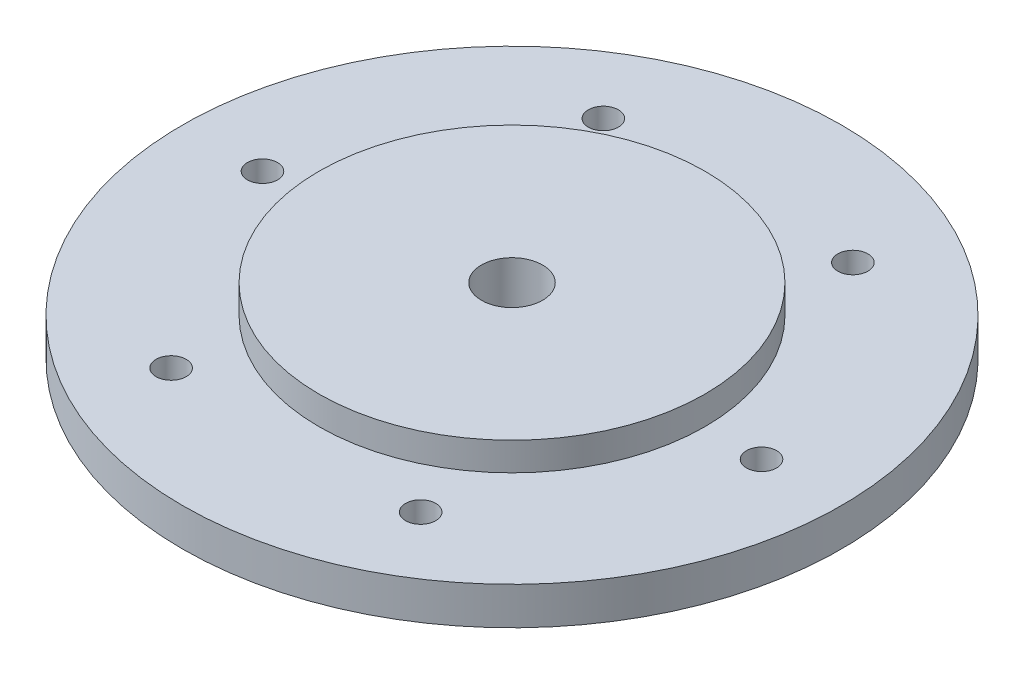
ISO-10303-21;
HEADER;
FILE_DESCRIPTION(('STEP AP214'),'2;1');
FILE_NAME('part.step','',(''),(''),'','','');
FILE_SCHEMA(('AUTOMOTIVE_DESIGN { 1 0 10303 214 1 1 1 1 }'));
ENDSEC;
DATA;
#1=APPLICATION_CONTEXT('core data for automotive mechanical design processes');
#2=APPLICATION_PROTOCOL_DEFINITION('international standard','automotive_design',2000,#1);
#3=PRODUCT_CONTEXT('',#1,'mechanical');
#4=PRODUCT('Part','Part','',(#3));
#5=PRODUCT_RELATED_PRODUCT_CATEGORY('part','',(#4));
#6=PRODUCT_DEFINITION_FORMATION('','',#4);
#7=PRODUCT_DEFINITION_CONTEXT('part definition',#1,'design');
#8=PRODUCT_DEFINITION('design','',#6,#7);
#9=PRODUCT_DEFINITION_SHAPE('','',#8);
#10=(LENGTH_UNIT() NAMED_UNIT(*) SI_UNIT(.MILLI.,.METRE.));
#11=(NAMED_UNIT(*) PLANE_ANGLE_UNIT() SI_UNIT($,.RADIAN.));
#12=(NAMED_UNIT(*) SI_UNIT($,.STERADIAN.) SOLID_ANGLE_UNIT());
#13=UNCERTAINTY_MEASURE_WITH_UNIT(LENGTH_MEASURE(1.E-05),#10,'distance_accuracy_value','');
#14=(GEOMETRIC_REPRESENTATION_CONTEXT(3) GLOBAL_UNCERTAINTY_ASSIGNED_CONTEXT((#13)) GLOBAL_UNIT_ASSIGNED_CONTEXT((#10,
#11,#12)) REPRESENTATION_CONTEXT('',''));
#15=CARTESIAN_POINT('',(0.,0.,0.));
#16=DIRECTION('',(0.,0.,1.));
#17=DIRECTION('',(1.,0.,0.));
#18=AXIS2_PLACEMENT_3D('',#15,#16,#17);
#19=CARTESIAN_POINT('',(0.,4.,0.));
#20=DIRECTION('',(0.,1.,0.));
#21=DIRECTION('',(0.,0.,1.));
#22=AXIS2_PLACEMENT_3D('',#19,#20,#21);
#23=PLANE('',#22);
#24=CARTESIAN_POINT('',(0.,4.,0.));
#25=DIRECTION('',(0.,1.,0.));
#26=DIRECTION('',(0.,0.,1.));
#27=AXIS2_PLACEMENT_3D('',#24,#25,#26);
#28=CIRCLE('',#27,17.5);
#29=CARTESIAN_POINT('',(0.,4.,17.5));
#30=VERTEX_POINT('',#29);
#31=EDGE_CURVE('E140',#30,#30,#28,.T.);
#32=ORIENTED_EDGE('',*,*,#31,.F.);
#33=EDGE_LOOP('',(#32));
#34=FACE_BOUND('',#33,.T.);
#35=CARTESIAN_POINT('',(0.,4.,0.));
#36=DIRECTION('',(0.,1.,0.));
#37=DIRECTION('',(0.,0.,1.));
#38=AXIS2_PLACEMENT_3D('',#35,#36,#37);
#39=CIRCLE('',#38,8.5);
#40=CARTESIAN_POINT('',(0.,4.,8.5));
#41=VERTEX_POINT('',#40);
#42=EDGE_CURVE('E10',#41,#41,#39,.F.);
#43=ORIENTED_EDGE('',*,*,#42,.F.);
#44=EDGE_LOOP('',(#43));
#45=FACE_BOUND('',#44,.T.);
#46=ADVANCED_FACE('F39',(#34,#45),#23,.F.);
#47=CARTESIAN_POINT('',(0.,4.,0.));
#48=DIRECTION('',(0.,-1.,0.));
#49=DIRECTION('',(0.,0.,-1.));
#50=AXIS2_PLACEMENT_3D('',#47,#48,#49);
#51=CYLINDRICAL_SURFACE('',#50,17.5);
#52=CARTESIAN_POINT('',(0.,0.,0.));
#53=DIRECTION('',(0.,1.,0.));
#54=DIRECTION('',(0.,0.,1.));
#55=AXIS2_PLACEMENT_3D('',#52,#53,#54);
#56=CIRCLE('',#55,17.5);
#57=CARTESIAN_POINT('',(0.,0.,17.5));
#58=VERTEX_POINT('',#57);
#59=EDGE_CURVE('E87',#58,#58,#56,.T.);
#60=ORIENTED_EDGE('',*,*,#59,.F.);
#61=EDGE_LOOP('',(#60));
#62=FACE_BOUND('',#61,.T.);
#63=ORIENTED_EDGE('',*,*,#31,.T.);
#64=EDGE_LOOP('',(#63));
#65=FACE_BOUND('',#64,.T.);
#66=ADVANCED_FACE('F127',(#62,#65),#51,.F.);
#67=CARTESIAN_POINT('',(0.,4.,0.));
#68=DIRECTION('',(0.,1.,0.));
#69=DIRECTION('',(0.,0.,1.));
#70=AXIS2_PLACEMENT_3D('',#67,#68,#69);
#71=PLANE('',#70);
#72=CARTESIAN_POINT('',(0.,4.,0.));
#73=DIRECTION('',(0.,1.,0.));
#74=DIRECTION('',(0.,0.,1.));
#75=AXIS2_PLACEMENT_3D('',#72,#73,#74);
#76=CIRCLE('',#75,35.);
#77=CARTESIAN_POINT('',(0.,4.,35.));
#78=VERTEX_POINT('',#77);
#79=EDGE_CURVE('E47',#78,#78,#76,.T.);
#80=ORIENTED_EDGE('',*,*,#79,.T.);
#81=EDGE_LOOP('',(#80));
#82=FACE_BOUND('',#81,.T.);
#83=CARTESIAN_POINT('',(-26.4999999999692,4.,0.));
#84=DIRECTION('',(0.,1.,0.));
#85=DIRECTION('',(0.,0.,1.));
#86=AXIS2_PLACEMENT_3D('',#83,#84,#85);
#87=CIRCLE('',#86,1.6);
#88=CARTESIAN_POINT('',(-26.4999999999692,4.,1.60000000000001));
#89=VERTEX_POINT('',#88);
#90=EDGE_CURVE('E52',#89,#89,#87,.T.);
#91=ORIENTED_EDGE('',*,*,#90,.F.);
#92=EDGE_LOOP('',(#91));
#93=FACE_BOUND('',#92,.T.);
#94=CARTESIAN_POINT('',(-13.2499999999845,4.,-22.949673200261));
#95=DIRECTION('',(0.,1.,0.));
#96=DIRECTION('',(0.,0.,1.));
#97=AXIS2_PLACEMENT_3D('',#94,#95,#96);
#98=CIRCLE('',#97,1.6);
#99=CARTESIAN_POINT('',(-13.2499999999845,4.,-21.349673200261));
#100=VERTEX_POINT('',#99);
#101=EDGE_CURVE('E58',#100,#100,#98,.T.);
#102=ORIENTED_EDGE('',*,*,#101,.F.);
#103=EDGE_LOOP('',(#102));
#104=FACE_BOUND('',#103,.T.);
#105=CARTESIAN_POINT('',(13.2499999999847,4.,-22.9496732002609));
#106=DIRECTION('',(0.,1.,0.));
#107=DIRECTION('',(0.,0.,1.));
#108=AXIS2_PLACEMENT_3D('',#105,#106,#107);
#109=CIRCLE('',#108,1.60000000000001);
#110=CARTESIAN_POINT('',(13.2499999999847,4.,-21.3496732002609));
#111=VERTEX_POINT('',#110);
#112=EDGE_CURVE('E113',#111,#111,#109,.T.);
#113=ORIENTED_EDGE('',*,*,#112,.F.);
#114=EDGE_LOOP('',(#113));
#115=FACE_BOUND('',#114,.T.);
#116=CARTESIAN_POINT('',(26.4999999999692,4.,1.81579064006517E-13));
#117=DIRECTION('',(0.,1.,0.));
#118=DIRECTION('',(0.,0.,1.));
#119=AXIS2_PLACEMENT_3D('',#116,#117,#118);
#120=CIRCLE('',#119,1.6);
#121=CARTESIAN_POINT('',(26.4999999999692,4.,1.60000000000018));
#122=VERTEX_POINT('',#121);
#123=EDGE_CURVE('E104',#122,#122,#120,.T.);
#124=ORIENTED_EDGE('',*,*,#123,.F.);
#125=EDGE_LOOP('',(#124));
#126=FACE_BOUND('',#125,.T.);
#127=CARTESIAN_POINT('',(13.2499999999844,4.,22.9496732002611));
#128=DIRECTION('',(0.,1.,0.));
#129=DIRECTION('',(0.,0.,1.));
#130=AXIS2_PLACEMENT_3D('',#127,#128,#129);
#131=CIRCLE('',#130,1.6);
#132=CARTESIAN_POINT('',(13.2499999999844,4.,24.5496732002611));
#133=VERTEX_POINT('',#132);
#134=EDGE_CURVE('E98',#133,#133,#131,.T.);
#135=ORIENTED_EDGE('',*,*,#134,.F.);
#136=EDGE_LOOP('',(#135));
#137=FACE_BOUND('',#136,.T.);
#138=CARTESIAN_POINT('',(-13.2499999999849,4.,22.9496732002608));
#139=DIRECTION('',(0.,1.,0.));
#140=DIRECTION('',(0.,0.,1.));
#141=AXIS2_PLACEMENT_3D('',#138,#139,#140);
#142=CIRCLE('',#141,1.6);
#143=CARTESIAN_POINT('',(-13.2499999999849,4.,24.5496732002608));
#144=VERTEX_POINT('',#143);
#145=EDGE_CURVE('E93',#144,#144,#142,.T.);
#146=ORIENTED_EDGE('',*,*,#145,.F.);
#147=EDGE_LOOP('',(#146));
#148=FACE_BOUND('',#147,.T.);
#149=CARTESIAN_POINT('',(0.,4.,0.));
#150=DIRECTION('',(0.,1.,0.));
#151=DIRECTION('',(0.,0.,1.));
#152=AXIS2_PLACEMENT_3D('',#149,#150,#151);
#153=CIRCLE('',#152,20.5);
#154=CARTESIAN_POINT('',(0.,4.,20.5));
#155=VERTEX_POINT('',#154);
#156=EDGE_CURVE('E107',#155,#155,#153,.T.);
#157=ORIENTED_EDGE('',*,*,#156,.F.);
#158=EDGE_LOOP('',(#157));
#159=FACE_BOUND('',#158,.T.);
#160=ADVANCED_FACE('F123',(#82,#93,#104,#115,#126,#137,#148,#159),#71,.T.);
#161=CARTESIAN_POINT('',(-26.4999999999692,4.,0.));
#162=DIRECTION('',(0.,-1.,0.));
#163=DIRECTION('',(0.,0.,-1.));
#164=AXIS2_PLACEMENT_3D('',#161,#162,#163);
#165=CYLINDRICAL_SURFACE('',#164,1.6);
#166=ORIENTED_EDGE('',*,*,#90,.T.);
#167=EDGE_LOOP('',(#166));
#168=FACE_BOUND('',#167,.T.);
#169=CARTESIAN_POINT('',(-26.4999999999692,0.,0.));
#170=DIRECTION('',(0.,1.,0.));
#171=DIRECTION('',(0.,0.,1.));
#172=AXIS2_PLACEMENT_3D('',#169,#170,#171);
#173=CIRCLE('',#172,1.6);
#174=CARTESIAN_POINT('',(-26.4999999999692,0.,1.60000000000001));
#175=VERTEX_POINT('',#174);
#176=EDGE_CURVE('E83',#175,#175,#173,.T.);
#177=ORIENTED_EDGE('',*,*,#176,.F.);
#178=EDGE_LOOP('',(#177));
#179=FACE_BOUND('',#178,.T.);
#180=ADVANCED_FACE('F126',(#168,#179),#165,.F.);
#181=CARTESIAN_POINT('',(-13.2499999999845,4.,-22.949673200261));
#182=DIRECTION('',(0.,-1.,0.));
#183=DIRECTION('',(0.,0.,-1.));
#184=AXIS2_PLACEMENT_3D('',#181,#182,#183);
#185=CYLINDRICAL_SURFACE('',#184,1.6);
#186=ORIENTED_EDGE('',*,*,#101,.T.);
#187=EDGE_LOOP('',(#186));
#188=FACE_BOUND('',#187,.T.);
#189=CARTESIAN_POINT('',(-13.2499999999845,0.,-22.949673200261));
#190=DIRECTION('',(0.,1.,0.));
#191=DIRECTION('',(0.,0.,1.));
#192=AXIS2_PLACEMENT_3D('',#189,#190,#191);
#193=CIRCLE('',#192,1.6);
#194=CARTESIAN_POINT('',(-13.2499999999845,0.,-21.349673200261));
#195=VERTEX_POINT('',#194);
#196=EDGE_CURVE('E79',#195,#195,#193,.T.);
#197=ORIENTED_EDGE('',*,*,#196,.F.);
#198=EDGE_LOOP('',(#197));
#199=FACE_BOUND('',#198,.T.);
#200=ADVANCED_FACE('F120',(#188,#199),#185,.F.);
#201=CARTESIAN_POINT('',(13.2499999999847,4.,-22.9496732002609));
#202=DIRECTION('',(0.,-1.,0.));
#203=DIRECTION('',(0.,0.,-1.));
#204=AXIS2_PLACEMENT_3D('',#201,#202,#203);
#205=CYLINDRICAL_SURFACE('',#204,1.60000000000001);
#206=ORIENTED_EDGE('',*,*,#112,.T.);
#207=EDGE_LOOP('',(#206));
#208=FACE_BOUND('',#207,.T.);
#209=CARTESIAN_POINT('',(13.2499999999847,0.,-22.9496732002609));
#210=DIRECTION('',(0.,1.,0.));
#211=DIRECTION('',(0.,0.,1.));
#212=AXIS2_PLACEMENT_3D('',#209,#210,#211);
#213=CIRCLE('',#212,1.60000000000001);
#214=CARTESIAN_POINT('',(13.2499999999847,0.,-21.3496732002609));
#215=VERTEX_POINT('',#214);
#216=EDGE_CURVE('E75',#215,#215,#213,.T.);
#217=ORIENTED_EDGE('',*,*,#216,.F.);
#218=EDGE_LOOP('',(#217));
#219=FACE_BOUND('',#218,.T.);
#220=ADVANCED_FACE('F208',(#208,#219),#205,.F.);
#221=CARTESIAN_POINT('',(26.4999999999692,4.,1.81579064006517E-13));
#222=DIRECTION('',(0.,-1.,0.));
#223=DIRECTION('',(0.,0.,-1.));
#224=AXIS2_PLACEMENT_3D('',#221,#222,#223);
#225=CYLINDRICAL_SURFACE('',#224,1.6);
#226=ORIENTED_EDGE('',*,*,#123,.T.);
#227=EDGE_LOOP('',(#226));
#228=FACE_BOUND('',#227,.T.);
#229=CARTESIAN_POINT('',(26.4999999999692,0.,1.81579064006517E-13));
#230=DIRECTION('',(0.,1.,0.));
#231=DIRECTION('',(0.,0.,1.));
#232=AXIS2_PLACEMENT_3D('',#229,#230,#231);
#233=CIRCLE('',#232,1.6);
#234=CARTESIAN_POINT('',(26.4999999999692,0.,1.60000000000018));
#235=VERTEX_POINT('',#234);
#236=EDGE_CURVE('E71',#235,#235,#233,.T.);
#237=ORIENTED_EDGE('',*,*,#236,.F.);
#238=EDGE_LOOP('',(#237));
#239=FACE_BOUND('',#238,.T.);
#240=ADVANCED_FACE('F211',(#228,#239),#225,.F.);
#241=CARTESIAN_POINT('',(13.2499999999844,4.,22.9496732002611));
#242=DIRECTION('',(0.,-1.,0.));
#243=DIRECTION('',(0.,0.,-1.));
#244=AXIS2_PLACEMENT_3D('',#241,#242,#243);
#245=CYLINDRICAL_SURFACE('',#244,1.6);
#246=ORIENTED_EDGE('',*,*,#134,.T.);
#247=EDGE_LOOP('',(#246));
#248=FACE_BOUND('',#247,.T.);
#249=CARTESIAN_POINT('',(13.2499999999844,0.,22.9496732002611));
#250=DIRECTION('',(0.,1.,0.));
#251=DIRECTION('',(0.,0.,1.));
#252=AXIS2_PLACEMENT_3D('',#249,#250,#251);
#253=CIRCLE('',#252,1.6);
#254=CARTESIAN_POINT('',(13.2499999999844,0.,24.5496732002611));
#255=VERTEX_POINT('',#254);
#256=EDGE_CURVE('E66',#255,#255,#253,.T.);
#257=ORIENTED_EDGE('',*,*,#256,.F.);
#258=EDGE_LOOP('',(#257));
#259=FACE_BOUND('',#258,.T.);
#260=ADVANCED_FACE('F214',(#248,#259),#245,.F.);
#261=CARTESIAN_POINT('',(-13.2499999999849,4.,22.9496732002608));
#262=DIRECTION('',(0.,-1.,0.));
#263=DIRECTION('',(0.,0.,-1.));
#264=AXIS2_PLACEMENT_3D('',#261,#262,#263);
#265=CYLINDRICAL_SURFACE('',#264,1.6);
#266=ORIENTED_EDGE('',*,*,#145,.T.);
#267=EDGE_LOOP('',(#266));
#268=FACE_BOUND('',#267,.T.);
#269=CARTESIAN_POINT('',(-13.2499999999849,0.,22.9496732002608));
#270=DIRECTION('',(0.,1.,0.));
#271=DIRECTION('',(0.,0.,1.));
#272=AXIS2_PLACEMENT_3D('',#269,#270,#271);
#273=CIRCLE('',#272,1.6);
#274=CARTESIAN_POINT('',(-13.2499999999849,0.,24.5496732002608));
#275=VERTEX_POINT('',#274);
#276=EDGE_CURVE('E62',#275,#275,#273,.T.);
#277=ORIENTED_EDGE('',*,*,#276,.F.);
#278=EDGE_LOOP('',(#277));
#279=FACE_BOUND('',#278,.T.);
#280=ADVANCED_FACE('F41',(#268,#279),#265,.F.);
#281=CARTESIAN_POINT('',(0.,4.,0.));
#282=DIRECTION('',(0.,-1.,0.));
#283=DIRECTION('',(0.,0.,-1.));
#284=AXIS2_PLACEMENT_3D('',#281,#282,#283);
#285=CYLINDRICAL_SURFACE('',#284,35.);
#286=ORIENTED_EDGE('',*,*,#79,.F.);
#287=EDGE_LOOP('',(#286));
#288=FACE_BOUND('',#287,.T.);
#289=CARTESIAN_POINT('',(0.,0.,0.));
#290=DIRECTION('',(0.,1.,0.));
#291=DIRECTION('',(0.,0.,1.));
#292=AXIS2_PLACEMENT_3D('',#289,#290,#291);
#293=CIRCLE('',#292,35.);
#294=CARTESIAN_POINT('',(0.,0.,35.));
#295=VERTEX_POINT('',#294);
#296=EDGE_CURVE('E90',#295,#295,#293,.T.);
#297=ORIENTED_EDGE('',*,*,#296,.T.);
#298=EDGE_LOOP('',(#297));
#299=FACE_BOUND('',#298,.T.);
#300=ADVANCED_FACE('F198',(#288,#299),#285,.T.);
#301=CARTESIAN_POINT('',(0.,0.,0.));
#302=DIRECTION('',(0.,1.,0.));
#303=DIRECTION('',(0.,0.,1.));
#304=AXIS2_PLACEMENT_3D('',#301,#302,#303);
#305=PLANE('',#304);
#306=ORIENTED_EDGE('',*,*,#276,.T.);
#307=EDGE_LOOP('',(#306));
#308=FACE_BOUND('',#307,.T.);
#309=ORIENTED_EDGE('',*,*,#256,.T.);
#310=EDGE_LOOP('',(#309));
#311=FACE_BOUND('',#310,.T.);
#312=ORIENTED_EDGE('',*,*,#236,.T.);
#313=EDGE_LOOP('',(#312));
#314=FACE_BOUND('',#313,.T.);
#315=ORIENTED_EDGE('',*,*,#216,.T.);
#316=EDGE_LOOP('',(#315));
#317=FACE_BOUND('',#316,.T.);
#318=ORIENTED_EDGE('',*,*,#196,.T.);
#319=EDGE_LOOP('',(#318));
#320=FACE_BOUND('',#319,.T.);
#321=ORIENTED_EDGE('',*,*,#176,.T.);
#322=EDGE_LOOP('',(#321));
#323=FACE_BOUND('',#322,.T.);
#324=ORIENTED_EDGE('',*,*,#59,.T.);
#325=EDGE_LOOP('',(#324));
#326=FACE_BOUND('',#325,.T.);
#327=ORIENTED_EDGE('',*,*,#296,.F.);
#328=EDGE_LOOP('',(#327));
#329=FACE_BOUND('',#328,.T.);
#330=ADVANCED_FACE('F191',(#308,#311,#314,#317,#320,#323,#326,#329),#305,.F.);
#331=CARTESIAN_POINT('',(0.,7.,0.));
#332=DIRECTION('',(0.,1.,0.));
#333=DIRECTION('',(0.,0.,1.));
#334=AXIS2_PLACEMENT_3D('',#331,#332,#333);
#335=PLANE('',#334);
#336=CARTESIAN_POINT('',(0.,7.,0.));
#337=DIRECTION('',(0.,1.,0.));
#338=DIRECTION('',(0.,0.,1.));
#339=AXIS2_PLACEMENT_3D('',#336,#337,#338);
#340=CIRCLE('',#339,20.5);
#341=CARTESIAN_POINT('',(0.,7.,20.5));
#342=VERTEX_POINT('',#341);
#343=EDGE_CURVE('E67',#342,#342,#340,.T.);
#344=ORIENTED_EDGE('',*,*,#343,.T.);
#345=EDGE_LOOP('',(#344));
#346=FACE_BOUND('',#345,.T.);
#347=CARTESIAN_POINT('',(0.,7.,0.));
#348=DIRECTION('',(0.,1.,0.));
#349=DIRECTION('',(0.,0.,1.));
#350=AXIS2_PLACEMENT_3D('',#347,#348,#349);
#351=CIRCLE('',#350,3.24999999999999);
#352=CARTESIAN_POINT('',(0.,7.,3.24999999999999));
#353=VERTEX_POINT('',#352);
#354=EDGE_CURVE('E145',#353,#353,#351,.T.);
#355=ORIENTED_EDGE('',*,*,#354,.F.);
#356=EDGE_LOOP('',(#355));
#357=FACE_BOUND('',#356,.T.);
#358=ADVANCED_FACE('F188',(#346,#357),#335,.T.);
#359=CARTESIAN_POINT('',(0.,7.,0.));
#360=DIRECTION('',(0.,-1.,0.));
#361=DIRECTION('',(0.,0.,-1.));
#362=AXIS2_PLACEMENT_3D('',#359,#360,#361);
#363=CYLINDRICAL_SURFACE('',#362,20.5);
#364=ORIENTED_EDGE('',*,*,#343,.F.);
#365=EDGE_LOOP('',(#364));
#366=FACE_BOUND('',#365,.T.);
#367=ORIENTED_EDGE('',*,*,#156,.T.);
#368=EDGE_LOOP('',(#367));
#369=FACE_BOUND('',#368,.T.);
#370=ADVANCED_FACE('F175',(#366,#369),#363,.T.);
#371=CARTESIAN_POINT('',(0.,4.,0.));
#372=DIRECTION('',(0.,1.,0.));
#373=DIRECTION('',(0.,0.,1.));
#374=AXIS2_PLACEMENT_3D('',#371,#372,#373);
#375=CYLINDRICAL_SURFACE('',#374,3.24999999999999);
#376=ORIENTED_EDGE('',*,*,#354,.T.);
#377=EDGE_LOOP('',(#376));
#378=FACE_BOUND('',#377,.T.);
#379=CARTESIAN_POINT('',(0.,0.,0.));
#380=DIRECTION('',(0.,-1.,0.));
#381=DIRECTION('',(0.,0.,-1.));
#382=AXIS2_PLACEMENT_3D('',#379,#380,#381);
#383=CIRCLE('',#382,3.24999999999999);
#384=CARTESIAN_POINT('',(0.,0.,-3.24999999999999));
#385=VERTEX_POINT('',#384);
#386=EDGE_CURVE('E157',#385,#385,#383,.T.);
#387=ORIENTED_EDGE('',*,*,#386,.T.);
#388=EDGE_LOOP('',(#387));
#389=FACE_BOUND('',#388,.T.);
#390=ADVANCED_FACE('F162',(#378,#389),#375,.F.);
#391=CARTESIAN_POINT('',(0.,0.,0.));
#392=DIRECTION('',(0.,-1.,0.));
#393=DIRECTION('',(0.,0.,-1.));
#394=AXIS2_PLACEMENT_3D('',#391,#392,#393);
#395=PLANE('',#394);
#396=CARTESIAN_POINT('',(0.,0.,0.));
#397=DIRECTION('',(0.,-1.,0.));
#398=DIRECTION('',(0.,0.,-1.));
#399=AXIS2_PLACEMENT_3D('',#396,#397,#398);
#400=CIRCLE('',#399,8.5);
#401=CARTESIAN_POINT('',(0.,0.,-8.5));
#402=VERTEX_POINT('',#401);
#403=EDGE_CURVE('E151',#402,#402,#400,.T.);
#404=ORIENTED_EDGE('',*,*,#403,.T.);
#405=EDGE_LOOP('',(#404));
#406=FACE_BOUND('',#405,.T.);
#407=ORIENTED_EDGE('',*,*,#386,.F.);
#408=EDGE_LOOP('',(#407));
#409=FACE_BOUND('',#408,.T.);
#410=ADVANCED_FACE('F164',(#406,#409),#395,.T.);
#411=CARTESIAN_POINT('',(0.,0.,0.));
#412=DIRECTION('',(0.,1.,0.));
#413=DIRECTION('',(0.,0.,1.));
#414=AXIS2_PLACEMENT_3D('',#411,#412,#413);
#415=CYLINDRICAL_SURFACE('',#414,8.5);
#416=ORIENTED_EDGE('',*,*,#403,.F.);
#417=EDGE_LOOP('',(#416));
#418=FACE_BOUND('',#417,.T.);
#419=ORIENTED_EDGE('',*,*,#42,.T.);
#420=EDGE_LOOP('',(#419));
#421=FACE_BOUND('',#420,.T.);
#422=ADVANCED_FACE('F166',(#418,#421),#415,.T.);
#423=CLOSED_SHELL('',(#46,#66,#160,#180,#200,#220,#240,#260,#280,#300,#330,#358,#370,#390,#410,#422));
#424=MANIFOLD_SOLID_BREP('B2',#423);
#425=ADVANCED_BREP_SHAPE_REPRESENTATION('',(#18,#424),#14);
#426=SHAPE_DEFINITION_REPRESENTATION(#9,#425);
ENDSEC;
END-ISO-10303-21;
